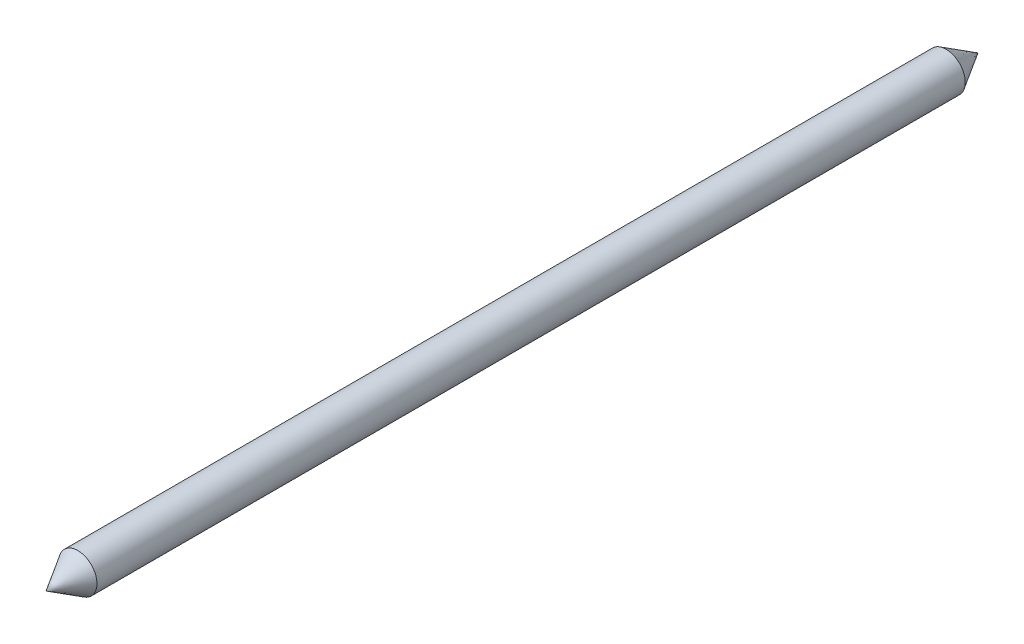
ISO-10303-21;
HEADER;
FILE_DESCRIPTION(('STEP AP214'),'2;1');
FILE_NAME('part.step','',(''),(''),'','','');
FILE_SCHEMA(('AUTOMOTIVE_DESIGN { 1 0 10303 214 1 1 1 1 }'));
ENDSEC;
DATA;
#1=APPLICATION_CONTEXT('core data for automotive mechanical design processes');
#2=APPLICATION_PROTOCOL_DEFINITION('international standard','automotive_design',2000,#1);
#3=PRODUCT_CONTEXT('',#1,'mechanical');
#4=PRODUCT('Part','Part','',(#3));
#5=PRODUCT_RELATED_PRODUCT_CATEGORY('part','',(#4));
#6=PRODUCT_DEFINITION_FORMATION('','',#4);
#7=PRODUCT_DEFINITION_CONTEXT('part definition',#1,'design');
#8=PRODUCT_DEFINITION('design','',#6,#7);
#9=PRODUCT_DEFINITION_SHAPE('','',#8);
#10=(LENGTH_UNIT() NAMED_UNIT(*) SI_UNIT(.MILLI.,.METRE.));
#11=(NAMED_UNIT(*) PLANE_ANGLE_UNIT() SI_UNIT($,.RADIAN.));
#12=(NAMED_UNIT(*) SI_UNIT($,.STERADIAN.) SOLID_ANGLE_UNIT());
#13=UNCERTAINTY_MEASURE_WITH_UNIT(LENGTH_MEASURE(1.E-05),#10,'distance_accuracy_value','');
#14=(GEOMETRIC_REPRESENTATION_CONTEXT(3) GLOBAL_UNCERTAINTY_ASSIGNED_CONTEXT((#13)) GLOBAL_UNIT_ASSIGNED_CONTEXT((#10,
#11,#12)) REPRESENTATION_CONTEXT('',''));
#15=CARTESIAN_POINT('',(0.,0.,0.));
#16=DIRECTION('',(0.,0.,1.));
#17=DIRECTION('',(1.,0.,0.));
#18=AXIS2_PLACEMENT_3D('',#15,#16,#17);
#19=CARTESIAN_POINT('',(0.,0.,-173.0375));
#20=DIRECTION('',(0.,0.,1.));
#21=DIRECTION('',(1.,0.,0.));
#22=AXIS2_PLACEMENT_3D('',#19,#20,#21);
#23=CONICAL_SURFACE('',#22,7.62000000000006,0.540419500270588);
#24=CARTESIAN_POINT('',(0.,0.,-185.7375));
#25=VERTEX_POINT('',#24);
#26=VERTEX_LOOP('',#25);
#27=FACE_BOUND('',#26,.T.);
#28=CARTESIAN_POINT('',(0.,0.,-173.0375));
#29=DIRECTION('',(0.,0.,1.));
#30=DIRECTION('',(1.,0.,0.));
#31=AXIS2_PLACEMENT_3D('',#28,#29,#30);
#32=CIRCLE('',#31,7.62000000000006);
#33=CARTESIAN_POINT('',(7.62,0.,-173.0375));
#34=VERTEX_POINT('',#33);
#35=EDGE_CURVE('E11',#34,#34,#32,.T.);
#36=ORIENTED_EDGE('',*,*,#35,.F.);
#37=EDGE_LOOP('',(#36));
#38=FACE_BOUND('',#37,.T.);
#39=ADVANCED_FACE('F45',(#27,#38),#23,.T.);
#40=CARTESIAN_POINT('',(0.,0.,185.7375));
#41=DIRECTION('',(0.,0.,1.));
#42=DIRECTION('',(1.,0.,0.));
#43=AXIS2_PLACEMENT_3D('',#40,#41,#42);
#44=CYLINDRICAL_SURFACE('',#43,7.62000000000005);
#45=ORIENTED_EDGE('',*,*,#35,.T.);
#46=EDGE_LOOP('',(#45));
#47=FACE_BOUND('',#46,.T.);
#48=CARTESIAN_POINT('',(0.,0.,173.0375));
#49=DIRECTION('',(0.,0.,1.));
#50=DIRECTION('',(1.,0.,0.));
#51=AXIS2_PLACEMENT_3D('',#48,#49,#50);
#52=CIRCLE('',#51,7.62000000000004);
#53=CARTESIAN_POINT('',(7.62000000000004,0.,173.0375));
#54=VERTEX_POINT('',#53);
#55=EDGE_CURVE('E53',#54,#54,#52,.T.);
#56=ORIENTED_EDGE('',*,*,#55,.F.);
#57=EDGE_LOOP('',(#56));
#58=FACE_BOUND('',#57,.T.);
#59=ADVANCED_FACE('F61',(#47,#58),#44,.T.);
#60=CARTESIAN_POINT('',(0.,0.,185.7375));
#61=DIRECTION('',(0.,0.,-1.));
#62=DIRECTION('',(-1.,0.,0.));
#63=AXIS2_PLACEMENT_3D('',#60,#61,#62);
#64=CONICAL_SURFACE('',#63,0.,0.540419500270587);
#65=ORIENTED_EDGE('',*,*,#55,.T.);
#66=EDGE_LOOP('',(#65));
#67=FACE_BOUND('',#66,.T.);
#68=CARTESIAN_POINT('',(0.,0.,185.7375));
#69=VERTEX_POINT('',#68);
#70=VERTEX_LOOP('',#69);
#71=FACE_BOUND('',#70,.T.);
#72=ADVANCED_FACE('F66',(#67,#71),#64,.T.);
#73=CLOSED_SHELL('',(#39,#59,#72));
#74=MANIFOLD_SOLID_BREP('B2',#73);
#75=ADVANCED_BREP_SHAPE_REPRESENTATION('',(#18,#74),#14);
#76=SHAPE_DEFINITION_REPRESENTATION(#9,#75);
ENDSEC;
END-ISO-10303-21;
